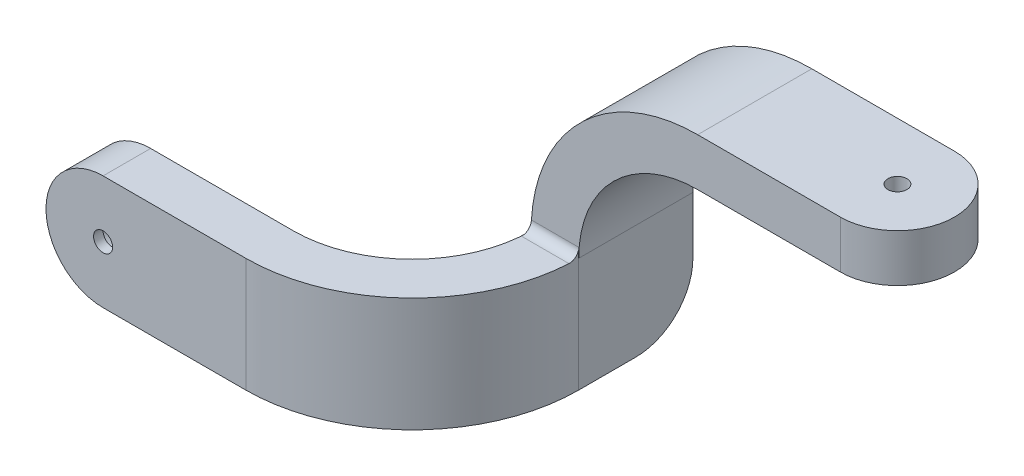
ISO-10303-21;
HEADER;
FILE_DESCRIPTION(('STEP AP214'),'2;1');
FILE_NAME('part.step','',(''),(''),'','','');
FILE_SCHEMA(('AUTOMOTIVE_DESIGN { 1 0 10303 214 1 1 1 1 }'));
ENDSEC;
DATA;
#1=APPLICATION_CONTEXT('core data for automotive mechanical design processes');
#2=APPLICATION_PROTOCOL_DEFINITION('international standard','automotive_design',2000,#1);
#3=PRODUCT_CONTEXT('',#1,'mechanical');
#4=PRODUCT('Part','Part','',(#3));
#5=PRODUCT_RELATED_PRODUCT_CATEGORY('part','',(#4));
#6=PRODUCT_DEFINITION_FORMATION('','',#4);
#7=PRODUCT_DEFINITION_CONTEXT('part definition',#1,'design');
#8=PRODUCT_DEFINITION('design','',#6,#7);
#9=PRODUCT_DEFINITION_SHAPE('','',#8);
#10=(LENGTH_UNIT() NAMED_UNIT(*) SI_UNIT(.MILLI.,.METRE.));
#11=(NAMED_UNIT(*) PLANE_ANGLE_UNIT() SI_UNIT($,.RADIAN.));
#12=(NAMED_UNIT(*) SI_UNIT($,.STERADIAN.) SOLID_ANGLE_UNIT());
#13=UNCERTAINTY_MEASURE_WITH_UNIT(LENGTH_MEASURE(1.E-05),#10,'distance_accuracy_value','');
#14=(GEOMETRIC_REPRESENTATION_CONTEXT(3) GLOBAL_UNCERTAINTY_ASSIGNED_CONTEXT((#13)) GLOBAL_UNIT_ASSIGNED_CONTEXT((#10,
#11,#12)) REPRESENTATION_CONTEXT('',''));
#15=CARTESIAN_POINT('',(0.,0.,0.));
#16=DIRECTION('',(0.,0.,1.));
#17=DIRECTION('',(1.,0.,0.));
#18=AXIS2_PLACEMENT_3D('',#15,#16,#17);
#19=CARTESIAN_POINT('',(-66.,-24.5,23.5));
#20=DIRECTION('',(0.,0.,-1.));
#21=DIRECTION('',(-1.,0.,0.));
#22=AXIS2_PLACEMENT_3D('',#19,#20,#21);
#23=PLANE('',#22);
#24=CARTESIAN_POINT('',(-60.,-18.5,23.5));
#25=DIRECTION('',(0.,0.,1.));
#26=DIRECTION('',(1.,0.,0.));
#27=AXIS2_PLACEMENT_3D('',#24,#25,#26);
#28=CIRCLE('',#27,0.999999999999998);
#29=CARTESIAN_POINT('',(-59.,-18.5,23.4999999999999));
#30=VERTEX_POINT('',#29);
#31=EDGE_CURVE('E220',#30,#30,#28,.T.);
#32=ORIENTED_EDGE('',*,*,#31,.F.);
#33=EDGE_LOOP('',(#32));
#34=FACE_BOUND('',#33,.T.);
#35=CARTESIAN_POINT('',(-60.,-18.5,23.5));
#36=DIRECTION('',(0.,0.,1.));
#37=DIRECTION('',(1.,0.,0.));
#38=AXIS2_PLACEMENT_3D('',#35,#36,#37);
#39=CIRCLE('',#38,6.);
#40=CARTESIAN_POINT('',(-60.,-12.5,23.5));
#41=VERTEX_POINT('',#40);
#42=CARTESIAN_POINT('',(-60.,-24.5,23.5));
#43=VERTEX_POINT('',#42);
#44=EDGE_CURVE('E201',#41,#43,#39,.T.);
#45=ORIENTED_EDGE('',*,*,#44,.T.);
#46=DIRECTION('',(1.,0.,0.));
#47=VECTOR('',#46,1.);
#48=CARTESIAN_POINT('',(-66.,-24.5,23.5));
#49=LINE('',#48,#47);
#50=CARTESIAN_POINT('',(-45.,-24.5,23.5));
#51=VERTEX_POINT('',#50);
#52=EDGE_CURVE('E205',#43,#51,#49,.T.);
#53=ORIENTED_EDGE('',*,*,#52,.T.);
#54=DIRECTION('',(0.,1.,0.));
#55=VECTOR('',#54,1.);
#56=CARTESIAN_POINT('',(-45.,-24.5,23.5));
#57=LINE('',#56,#55);
#58=CARTESIAN_POINT('',(-45.,-12.5,23.5));
#59=VERTEX_POINT('',#58);
#60=EDGE_CURVE('E228',#51,#59,#57,.T.);
#61=ORIENTED_EDGE('',*,*,#60,.T.);
#62=DIRECTION('',(1.,0.,0.));
#63=VECTOR('',#62,1.);
#64=CARTESIAN_POINT('',(-66.,-12.5,23.5));
#65=LINE('',#64,#63);
#66=EDGE_CURVE('E208',#41,#59,#65,.T.);
#67=ORIENTED_EDGE('',*,*,#66,.F.);
#68=EDGE_LOOP('',(#45,#53,#61,#67));
#69=FACE_BOUND('',#68,.T.);
#70=ADVANCED_FACE('F91',(#34,#69),#23,.F.);
#71=CARTESIAN_POINT('',(-66.,-12.5,18.5));
#72=DIRECTION('',(0.,0.,1.));
#73=DIRECTION('',(1.,0.,0.));
#74=AXIS2_PLACEMENT_3D('',#71,#72,#73);
#75=PLANE('',#74);
#76=CARTESIAN_POINT('',(-60.,-18.5,18.5));
#77=DIRECTION('',(0.,0.,1.));
#78=DIRECTION('',(1.,0.,0.));
#79=AXIS2_PLACEMENT_3D('',#76,#77,#78);
#80=CIRCLE('',#79,2.25);
#81=CARTESIAN_POINT('',(-57.75,-18.5,18.5));
#82=VERTEX_POINT('',#81);
#83=EDGE_CURVE('E458',#82,#82,#80,.F.);
#84=ORIENTED_EDGE('',*,*,#83,.F.);
#85=EDGE_LOOP('',(#84));
#86=FACE_BOUND('',#85,.T.);
#87=DIRECTION('',(1.,0.,0.));
#88=VECTOR('',#87,1.);
#89=CARTESIAN_POINT('',(-66.,-24.5,18.5));
#90=LINE('',#89,#88);
#91=CARTESIAN_POINT('',(-60.,-24.5,18.5));
#92=VERTEX_POINT('',#91);
#93=CARTESIAN_POINT('',(-45.,-24.5,18.5));
#94=VERTEX_POINT('',#93);
#95=EDGE_CURVE('E434',#92,#94,#90,.T.);
#96=ORIENTED_EDGE('',*,*,#95,.F.);
#97=CARTESIAN_POINT('',(-60.,-18.5,18.5));
#98=DIRECTION('',(0.,0.,1.));
#99=DIRECTION('',(1.,0.,0.));
#100=AXIS2_PLACEMENT_3D('',#97,#98,#99);
#101=CIRCLE('',#100,6.);
#102=CARTESIAN_POINT('',(-60.,-12.5,18.5));
#103=VERTEX_POINT('',#102);
#104=EDGE_CURVE('E212',#92,#103,#101,.F.);
#105=ORIENTED_EDGE('',*,*,#104,.T.);
#106=DIRECTION('',(1.,0.,0.));
#107=VECTOR('',#106,1.);
#108=CARTESIAN_POINT('',(-66.,-12.5,18.5));
#109=LINE('',#108,#107);
#110=CARTESIAN_POINT('',(-45.,-12.5,18.5));
#111=VERTEX_POINT('',#110);
#112=EDGE_CURVE('E230',#103,#111,#109,.T.);
#113=ORIENTED_EDGE('',*,*,#112,.T.);
#114=DIRECTION('',(0.,-1.,0.));
#115=VECTOR('',#114,1.);
#116=CARTESIAN_POINT('',(-45.,-12.5,18.5));
#117=LINE('',#116,#115);
#118=EDGE_CURVE('E240',#111,#94,#117,.T.);
#119=ORIENTED_EDGE('',*,*,#118,.T.);
#120=EDGE_LOOP('',(#96,#105,#113,#119));
#121=FACE_BOUND('',#120,.T.);
#122=ADVANCED_FACE('F387',(#86,#121),#75,.F.);
#123=CARTESIAN_POINT('',(-27.5,-12.5,6.));
#124=DIRECTION('',(0.,1.,0.));
#125=DIRECTION('',(0.,0.,1.));
#126=AXIS2_PLACEMENT_3D('',#123,#124,#125);
#127=PLANE('',#126);
#128=CARTESIAN_POINT('',(-45.,-12.5,6.));
#129=DIRECTION('',(0.,-1.,0.));
#130=DIRECTION('',(1.,0.,0.));
#131=AXIS2_PLACEMENT_3D('',#128,#129,#130);
#132=CIRCLE('',#131,17.5);
#133=CARTESIAN_POINT('',(-27.5285947903438,-12.5,7.));
#134=VERTEX_POINT('',#133);
#135=EDGE_CURVE('E235',#134,#59,#132,.T.);
#136=ORIENTED_EDGE('',*,*,#135,.F.);
#137=DIRECTION('',(-1.,0.,0.));
#138=VECTOR('',#137,1.);
#139=CARTESIAN_POINT('',(-32.5,-12.5,7.));
#140=LINE('',#139,#138);
#141=CARTESIAN_POINT('',(-32.5,-12.5,7.));
#142=VERTEX_POINT('',#141);
#143=EDGE_CURVE('E324',#134,#142,#140,.T.);
#144=ORIENTED_EDGE('',*,*,#143,.T.);
#145=DIRECTION('',(0.,0.,1.));
#146=VECTOR('',#145,1.);
#147=CARTESIAN_POINT('',(-32.5,-12.5,7.));
#148=LINE('',#147,#146);
#149=CARTESIAN_POINT('',(-32.5,-12.5,6.));
#150=VERTEX_POINT('',#149);
#151=EDGE_CURVE('E322',#142,#150,#148,.F.);
#152=ORIENTED_EDGE('',*,*,#151,.T.);
#153=CARTESIAN_POINT('',(-45.,-12.5,6.));
#154=DIRECTION('',(0.,-1.,0.));
#155=DIRECTION('',(1.,0.,0.));
#156=AXIS2_PLACEMENT_3D('',#153,#154,#155);
#157=CIRCLE('',#156,12.5);
#158=EDGE_CURVE('E236',#150,#111,#157,.T.);
#159=ORIENTED_EDGE('',*,*,#158,.T.);
#160=ORIENTED_EDGE('',*,*,#112,.F.);
#161=DIRECTION('',(0.,0.,1.));
#162=VECTOR('',#161,1.);
#163=CARTESIAN_POINT('',(-60.,-12.5,-6.001));
#164=LINE('',#163,#162);
#165=EDGE_CURVE('E211',#103,#41,#164,.T.);
#166=ORIENTED_EDGE('',*,*,#165,.T.);
#167=ORIENTED_EDGE('',*,*,#66,.T.);
#168=EDGE_LOOP('',(#136,#144,#152,#159,#160,#166,#167));
#169=FACE_BOUND('',#168,.T.);
#170=ADVANCED_FACE('F369',(#169),#127,.T.);
#171=CARTESIAN_POINT('',(0.,5.,0.));
#172=DIRECTION('',(0.,-1.,0.));
#173=DIRECTION('',(0.,0.,-1.));
#174=AXIS2_PLACEMENT_3D('',#171,#172,#173);
#175=CYLINDRICAL_SURFACE('',#174,6.);
#176=CARTESIAN_POINT('',(0.,0.,0.));
#177=DIRECTION('',(0.,1.,0.));
#178=DIRECTION('',(0.,0.,1.));
#179=AXIS2_PLACEMENT_3D('',#176,#177,#178);
#180=CIRCLE('',#179,6.);
#181=CARTESIAN_POINT('',(0.,0.,6.));
#182=VERTEX_POINT('',#181);
#183=CARTESIAN_POINT('',(0.,0.,-6.));
#184=VERTEX_POINT('',#183);
#185=EDGE_CURVE('E302',#182,#184,#180,.T.);
#186=ORIENTED_EDGE('',*,*,#185,.T.);
#187=DIRECTION('',(0.,-1.,0.));
#188=VECTOR('',#187,1.);
#189=CARTESIAN_POINT('',(0.,5.,-6.));
#190=LINE('',#189,#188);
#191=CARTESIAN_POINT('',(0.,5.,-6.));
#192=VERTEX_POINT('',#191);
#193=EDGE_CURVE('E300',#192,#184,#190,.T.);
#194=ORIENTED_EDGE('',*,*,#193,.F.);
#195=CARTESIAN_POINT('',(0.,5.,0.));
#196=DIRECTION('',(0.,1.,0.));
#197=DIRECTION('',(0.,0.,1.));
#198=AXIS2_PLACEMENT_3D('',#195,#196,#197);
#199=CIRCLE('',#198,6.);
#200=CARTESIAN_POINT('',(0.,5.,6.));
#201=VERTEX_POINT('',#200);
#202=EDGE_CURVE('E291',#201,#192,#199,.T.);
#203=ORIENTED_EDGE('',*,*,#202,.F.);
#204=DIRECTION('',(0.,-1.,0.));
#205=VECTOR('',#204,1.);
#206=CARTESIAN_POINT('',(0.,5.,6.));
#207=LINE('',#206,#205);
#208=EDGE_CURVE('E311',#201,#182,#207,.T.);
#209=ORIENTED_EDGE('',*,*,#208,.T.);
#210=EDGE_LOOP('',(#186,#194,#203,#209));
#211=FACE_BOUND('',#210,.T.);
#212=ADVANCED_FACE('F365',(#211),#175,.T.);
#213=CARTESIAN_POINT('',(0.,5.,-6.));
#214=DIRECTION('',(0.,0.,-1.));
#215=DIRECTION('',(-1.,0.,0.));
#216=AXIS2_PLACEMENT_3D('',#213,#214,#215);
#217=PLANE('',#216);
#218=DIRECTION('',(0.,1.,0.));
#219=VECTOR('',#218,1.);
#220=CARTESIAN_POINT('',(-27.5,-24.5,-6.));
#221=LINE('',#220,#219);
#222=CARTESIAN_POINT('',(-27.5,-18.5,-6.));
#223=VERTEX_POINT('',#222);
#224=CARTESIAN_POINT('',(-27.5,-12.5,-6.));
#225=VERTEX_POINT('',#224);
#226=EDGE_CURVE('E255',#223,#225,#221,.T.);
#227=ORIENTED_EDGE('',*,*,#226,.F.);
#228=DIRECTION('',(1.,0.,0.));
#229=VECTOR('',#228,1.);
#230=CARTESIAN_POINT('',(0.,-18.5,-6.));
#231=LINE('',#230,#229);
#232=CARTESIAN_POINT('',(-32.5,-18.5,-6.));
#233=VERTEX_POINT('',#232);
#234=EDGE_CURVE('E318',#223,#233,#231,.F.);
#235=ORIENTED_EDGE('',*,*,#234,.T.);
#236=DIRECTION('',(0.,1.,0.));
#237=VECTOR('',#236,1.);
#238=CARTESIAN_POINT('',(-32.5,-24.5,-6.));
#239=LINE('',#238,#237);
#240=CARTESIAN_POINT('',(-32.5,-12.5,-6.));
#241=VERTEX_POINT('',#240);
#242=EDGE_CURVE('E257',#233,#241,#239,.T.);
#243=ORIENTED_EDGE('',*,*,#242,.T.);
#244=CARTESIAN_POINT('',(-15.,-12.5,-6.));
#245=DIRECTION('',(0.,0.,1.));
#246=DIRECTION('',(0.,1.,0.));
#247=AXIS2_PLACEMENT_3D('',#244,#245,#246);
#248=CIRCLE('',#247,17.5);
#249=CARTESIAN_POINT('',(-15.,5.,-6.));
#250=VERTEX_POINT('',#249);
#251=EDGE_CURVE('E259',#250,#241,#248,.T.);
#252=ORIENTED_EDGE('',*,*,#251,.F.);
#253=DIRECTION('',(1.,0.,0.));
#254=VECTOR('',#253,1.);
#255=CARTESIAN_POINT('',(0.,5.,-6.));
#256=LINE('',#255,#254);
#257=EDGE_CURVE('E294',#250,#192,#256,.T.);
#258=ORIENTED_EDGE('',*,*,#257,.T.);
#259=ORIENTED_EDGE('',*,*,#193,.T.);
#260=DIRECTION('',(1.,0.,0.));
#261=VECTOR('',#260,1.);
#262=CARTESIAN_POINT('',(0.,0.,-6.));
#263=LINE('',#262,#261);
#264=CARTESIAN_POINT('',(-15.,0.,-6.));
#265=VERTEX_POINT('',#264);
#266=EDGE_CURVE('E305',#265,#184,#263,.T.);
#267=ORIENTED_EDGE('',*,*,#266,.F.);
#268=CARTESIAN_POINT('',(-15.,-12.5,-6.));
#269=DIRECTION('',(0.,0.,1.));
#270=DIRECTION('',(0.,1.,0.));
#271=AXIS2_PLACEMENT_3D('',#268,#269,#270);
#272=CIRCLE('',#271,12.5);
#273=EDGE_CURVE('E260',#265,#225,#272,.T.);
#274=ORIENTED_EDGE('',*,*,#273,.T.);
#275=EDGE_LOOP('',(#227,#235,#243,#252,#258,#259,#267,#274));
#276=FACE_BOUND('',#275,.T.);
#277=ADVANCED_FACE('F362',(#276),#217,.T.);
#278=CARTESIAN_POINT('',(0.,5.,6.));
#279=DIRECTION('',(0.,0.,1.));
#280=DIRECTION('',(1.,0.,0.));
#281=AXIS2_PLACEMENT_3D('',#278,#279,#280);
#282=PLANE('',#281);
#283=CARTESIAN_POINT('',(-15.,-12.5,6.));
#284=DIRECTION('',(0.,0.,1.));
#285=DIRECTION('',(0.,1.,0.));
#286=AXIS2_PLACEMENT_3D('',#283,#284,#285);
#287=CIRCLE('',#286,17.5);
#288=CARTESIAN_POINT('',(-15.,5.,6.));
#289=VERTEX_POINT('',#288);
#290=CARTESIAN_POINT('',(-32.4714052096561,-11.5,6.));
#291=VERTEX_POINT('',#290);
#292=EDGE_CURVE('E271',#289,#291,#287,.T.);
#293=ORIENTED_EDGE('',*,*,#292,.T.);
#294=DIRECTION('',(-1.,0.,0.));
#295=VECTOR('',#294,1.);
#296=CARTESIAN_POINT('',(-27.5,-11.5,6.));
#297=LINE('',#296,#295);
#298=CARTESIAN_POINT('',(-27.5,-11.5,6.));
#299=VERTEX_POINT('',#298);
#300=EDGE_CURVE('E328',#291,#299,#297,.F.);
#301=ORIENTED_EDGE('',*,*,#300,.T.);
#302=DIRECTION('',(0.,-1.,0.));
#303=VECTOR('',#302,1.);
#304=CARTESIAN_POINT('',(-27.5,-11.5,6.));
#305=LINE('',#304,#303);
#306=CARTESIAN_POINT('',(-27.5,-12.5,6.));
#307=VERTEX_POINT('',#306);
#308=EDGE_CURVE('E110',#299,#307,#305,.T.);
#309=ORIENTED_EDGE('',*,*,#308,.T.);
#310=CARTESIAN_POINT('',(-15.,-12.5,6.));
#311=DIRECTION('',(0.,0.,1.));
#312=DIRECTION('',(0.,1.,0.));
#313=AXIS2_PLACEMENT_3D('',#310,#311,#312);
#314=CIRCLE('',#313,12.5);
#315=CARTESIAN_POINT('',(-15.,0.,6.));
#316=VERTEX_POINT('',#315);
#317=EDGE_CURVE('E268',#316,#307,#314,.T.);
#318=ORIENTED_EDGE('',*,*,#317,.F.);
#319=DIRECTION('',(-1.,0.,0.));
#320=VECTOR('',#319,1.);
#321=CARTESIAN_POINT('',(0.,0.,6.));
#322=LINE('',#321,#320);
#323=EDGE_CURVE('E288',#182,#316,#322,.T.);
#324=ORIENTED_EDGE('',*,*,#323,.F.);
#325=ORIENTED_EDGE('',*,*,#208,.F.);
#326=DIRECTION('',(-1.,0.,0.));
#327=VECTOR('',#326,1.);
#328=CARTESIAN_POINT('',(0.,5.,6.));
#329=LINE('',#328,#327);
#330=EDGE_CURVE('E289',#201,#289,#329,.T.);
#331=ORIENTED_EDGE('',*,*,#330,.T.);
#332=EDGE_LOOP('',(#293,#301,#309,#318,#324,#325,#331));
#333=FACE_BOUND('',#332,.T.);
#334=ADVANCED_FACE('F360',(#333),#282,.T.);
#335=CARTESIAN_POINT('',(0.,0.,0.));
#336=DIRECTION('',(0.,1.,0.));
#337=DIRECTION('',(0.,0.,1.));
#338=AXIS2_PLACEMENT_3D('',#335,#336,#337);
#339=PLANE('',#338);
#340=CARTESIAN_POINT('',(0.,0.,0.));
#341=DIRECTION('',(0.,1.,0.));
#342=DIRECTION('',(0.,0.,1.));
#343=AXIS2_PLACEMENT_3D('',#340,#341,#342);
#344=CIRCLE('',#343,2.25);
#345=CARTESIAN_POINT('',(0.,0.,2.25));
#346=VERTEX_POINT('',#345);
#347=EDGE_CURVE('E276',#346,#346,#344,.T.);
#348=ORIENTED_EDGE('',*,*,#347,.T.);
#349=EDGE_LOOP('',(#348));
#350=FACE_BOUND('',#349,.T.);
#351=ORIENTED_EDGE('',*,*,#323,.T.);
#352=DIRECTION('',(0.,0.,-1.));
#353=VECTOR('',#352,1.);
#354=CARTESIAN_POINT('',(-15.,0.,0.));
#355=LINE('',#354,#353);
#356=EDGE_CURVE('E292',#316,#265,#355,.T.);
#357=ORIENTED_EDGE('',*,*,#356,.T.);
#358=ORIENTED_EDGE('',*,*,#266,.T.);
#359=ORIENTED_EDGE('',*,*,#185,.F.);
#360=EDGE_LOOP('',(#351,#357,#358,#359));
#361=FACE_BOUND('',#360,.T.);
#362=ADVANCED_FACE('F356',(#350,#361),#339,.F.);
#363=CARTESIAN_POINT('',(0.,5.,0.));
#364=DIRECTION('',(0.,1.,0.));
#365=DIRECTION('',(0.,0.,1.));
#366=AXIS2_PLACEMENT_3D('',#363,#364,#365);
#367=PLANE('',#366);
#368=CARTESIAN_POINT('',(0.,5.,0.));
#369=DIRECTION('',(0.,1.,0.));
#370=DIRECTION('',(0.,0.,1.));
#371=AXIS2_PLACEMENT_3D('',#368,#369,#370);
#372=CIRCLE('',#371,1.);
#373=CARTESIAN_POINT('',(0.,5.,1.));
#374=VERTEX_POINT('',#373);
#375=EDGE_CURVE('E283',#374,#374,#372,.T.);
#376=ORIENTED_EDGE('',*,*,#375,.F.);
#377=EDGE_LOOP('',(#376));
#378=FACE_BOUND('',#377,.T.);
#379=ORIENTED_EDGE('',*,*,#330,.F.);
#380=ORIENTED_EDGE('',*,*,#202,.T.);
#381=ORIENTED_EDGE('',*,*,#257,.F.);
#382=DIRECTION('',(0.,0.,-1.));
#383=VECTOR('',#382,1.);
#384=CARTESIAN_POINT('',(-15.,5.,0.));
#385=LINE('',#384,#383);
#386=EDGE_CURVE('E297',#289,#250,#385,.T.);
#387=ORIENTED_EDGE('',*,*,#386,.F.);
#388=EDGE_LOOP('',(#379,#380,#381,#387));
#389=FACE_BOUND('',#388,.T.);
#390=ADVANCED_FACE('F352',(#378,#389),#367,.T.);
#391=CARTESIAN_POINT('',(0.,5.001,0.));
#392=DIRECTION('',(0.,-1.,0.));
#393=DIRECTION('',(0.,0.,-1.));
#394=AXIS2_PLACEMENT_3D('',#391,#392,#393);
#395=CYLINDRICAL_SURFACE('',#394,1.);
#396=CARTESIAN_POINT('',(0.,3.5,0.));
#397=DIRECTION('',(0.,1.,0.));
#398=DIRECTION('',(0.,0.,1.));
#399=AXIS2_PLACEMENT_3D('',#396,#397,#398);
#400=CIRCLE('',#399,1.);
#401=CARTESIAN_POINT('',(0.,3.5,1.));
#402=VERTEX_POINT('',#401);
#403=EDGE_CURVE('E277',#402,#402,#400,.T.);
#404=ORIENTED_EDGE('',*,*,#403,.F.);
#405=EDGE_LOOP('',(#404));
#406=FACE_BOUND('',#405,.T.);
#407=ORIENTED_EDGE('',*,*,#375,.T.);
#408=EDGE_LOOP('',(#407));
#409=FACE_BOUND('',#408,.T.);
#410=ADVANCED_FACE('F348',(#406,#409),#395,.F.);
#411=CARTESIAN_POINT('',(0.,3.5,0.));
#412=DIRECTION('',(0.,-1.,0.));
#413=DIRECTION('',(0.,0.,-1.));
#414=AXIS2_PLACEMENT_3D('',#411,#412,#413);
#415=CYLINDRICAL_SURFACE('',#414,2.25);
#416=CARTESIAN_POINT('',(0.,3.5,0.));
#417=DIRECTION('',(0.,1.,0.));
#418=DIRECTION('',(0.,0.,1.));
#419=AXIS2_PLACEMENT_3D('',#416,#417,#418);
#420=CIRCLE('',#419,2.25);
#421=CARTESIAN_POINT('',(0.,3.5,2.25));
#422=VERTEX_POINT('',#421);
#423=EDGE_CURVE('E280',#422,#422,#420,.T.);
#424=ORIENTED_EDGE('',*,*,#423,.T.);
#425=EDGE_LOOP('',(#424));
#426=FACE_BOUND('',#425,.T.);
#427=ORIENTED_EDGE('',*,*,#347,.F.);
#428=EDGE_LOOP('',(#427));
#429=FACE_BOUND('',#428,.T.);
#430=ADVANCED_FACE('F344',(#426,#429),#415,.F.);
#431=CARTESIAN_POINT('',(0.,3.5,0.));
#432=DIRECTION('',(0.,1.,0.));
#433=DIRECTION('',(0.,0.,1.));
#434=AXIS2_PLACEMENT_3D('',#431,#432,#433);
#435=PLANE('',#434);
#436=ORIENTED_EDGE('',*,*,#403,.T.);
#437=EDGE_LOOP('',(#436));
#438=FACE_BOUND('',#437,.T.);
#439=ORIENTED_EDGE('',*,*,#423,.F.);
#440=EDGE_LOOP('',(#439));
#441=FACE_BOUND('',#440,.T.);
#442=ADVANCED_FACE('F340',(#438,#441),#435,.F.);
#443=CARTESIAN_POINT('',(-15.,-12.5,0.));
#444=DIRECTION('',(0.,0.,1.));
#445=DIRECTION('',(1.,0.,0.));
#446=AXIS2_PLACEMENT_3D('',#443,#444,#445);
#447=CYLINDRICAL_SURFACE('',#446,12.5);
#448=ORIENTED_EDGE('',*,*,#317,.T.);
#449=DIRECTION('',(0.,0.,1.));
#450=VECTOR('',#449,1.);
#451=CARTESIAN_POINT('',(-27.5,-12.5,-6.));
#452=LINE('',#451,#450);
#453=EDGE_CURVE('E263',#225,#307,#452,.T.);
#454=ORIENTED_EDGE('',*,*,#453,.F.);
#455=ORIENTED_EDGE('',*,*,#273,.F.);
#456=ORIENTED_EDGE('',*,*,#356,.F.);
#457=EDGE_LOOP('',(#448,#454,#455,#456));
#458=FACE_BOUND('',#457,.T.);
#459=ADVANCED_FACE('F339',(#458),#447,.F.);
#460=CARTESIAN_POINT('',(-15.,-12.5,0.));
#461=DIRECTION('',(0.,0.,1.));
#462=DIRECTION('',(1.,0.,0.));
#463=AXIS2_PLACEMENT_3D('',#460,#461,#462);
#464=CYLINDRICAL_SURFACE('',#463,17.5);
#465=DIRECTION('',(0.,0.,-1.));
#466=VECTOR('',#465,1.);
#467=CARTESIAN_POINT('',(-32.5,-12.5,6.));
#468=LINE('',#467,#466);
#469=EDGE_CURVE('E273',#150,#241,#468,.T.);
#470=ORIENTED_EDGE('',*,*,#469,.F.);
#471=ORIENTED_EDGE('',*,*,#151,.F.);
#472=CARTESIAN_POINT('',(-32.5,-12.5,7.));
#473=CARTESIAN_POINT('',(-32.4999996091509,-12.4999998127607,6.97186615677315));
#474=CARTESIAN_POINT('',(-32.5000000439234,-12.4988119854541,6.94374579158928));
#475=CARTESIAN_POINT('',(-32.4999992329581,-12.4940732576612,6.88770626954891));
#476=CARTESIAN_POINT('',(-32.4999979873007,-12.4905224702014,6.85978710313313));
#477=CARTESIAN_POINT('',(-32.4999867451649,-12.4763593403235,6.77667986746539));
#478=CARTESIAN_POINT('',(-32.4999692641114,-12.4622361372248,6.7220484542037));
#479=CARTESIAN_POINT('',(-32.4998491440497,-12.4250190547405,6.61593353593528));
#480=CARTESIAN_POINT('',(-32.4997464639824,-12.4019208529725,6.56445156155484));
#481=CARTESIAN_POINT('',(-32.4993558971677,-12.3474120868828,6.46609794134878));
#482=CARTESIAN_POINT('',(-32.4990680429394,-12.3160029826458,6.41922548769056));
#483=CARTESIAN_POINT('',(-32.4981883759898,-12.245769737472,6.33142829507339));
#484=CARTESIAN_POINT('',(-32.497596607766,-12.2069466825719,6.29050268653167));
#485=CARTESIAN_POINT('',(-32.4959885081659,-12.1229781478714,6.21574367072342));
#486=CARTESIAN_POINT('',(-32.4949720996022,-12.0778315196202,6.18191155452887));
#487=CARTESIAN_POINT('',(-32.4924126000598,-11.9825345730521,6.12232202613543));
#488=CARTESIAN_POINT('',(-32.4908697104046,-11.9323861725655,6.09656153460358));
#489=CARTESIAN_POINT('',(-32.4871893464979,-11.8285074442907,6.05383285658094));
#490=CARTESIAN_POINT('',(-32.4850522080629,-11.7747791525396,6.03685971971773));
#491=CARTESIAN_POINT('',(-32.4809997747978,-11.6839381158679,6.01636362900836));
#492=CARTESIAN_POINT('',(-32.4792559883734,-11.6473851673782,6.01022989057761));
#493=CARTESIAN_POINT('',(-32.4755168010448,-11.5738907943862,6.00204856292251));
#494=CARTESIAN_POINT('',(-32.4735217644906,-11.5369500020262,5.99999512758194));
#495=CARTESIAN_POINT('',(-32.4714052096561,-11.5,6.));
#496=B_SPLINE_CURVE_WITH_KNOTS('',3,(#472,#473,#474,#475,#476,#477,#478,#479,#480,#481,#482,
#483,#484,#485,#486,#487,#488,#489,#490,#491,#492,#493,#494,#495),.UNSPECIFIED.,.F.,.F.,(4,2,2,
2,2,2,2,2,2,2,2,4),(0.,0.0843496900531551,0.168695345736187,0.337109408409717,0.50560468045966,
0.674070370375946,0.842511401401841,1.01098306347175,1.17939037495667,1.34770271035486,
1.45880497908079,1.56974794923432),.UNSPECIFIED.);
#497=EDGE_CURVE('E104',#142,#291,#496,.T.);
#498=ORIENTED_EDGE('',*,*,#497,.T.);
#499=ORIENTED_EDGE('',*,*,#292,.F.);
#500=ORIENTED_EDGE('',*,*,#386,.T.);
#501=ORIENTED_EDGE('',*,*,#251,.T.);
#502=EDGE_LOOP('',(#470,#471,#498,#499,#500,#501));
#503=FACE_BOUND('',#502,.T.);
#504=ADVANCED_FACE('F333',(#503),#464,.T.);
#505=CARTESIAN_POINT('',(-32.5,-24.5,6.));
#506=DIRECTION('',(1.,0.,0.));
#507=DIRECTION('',(0.,0.,-1.));
#508=AXIS2_PLACEMENT_3D('',#505,#506,#507);
#509=PLANE('',#508);
#510=ORIENTED_EDGE('',*,*,#242,.F.);
#511=CARTESIAN_POINT('',(-32.5,-18.5,0.));
#512=DIRECTION('',(1.,0.,0.));
#513=DIRECTION('',(0.,0.,-1.));
#514=AXIS2_PLACEMENT_3D('',#511,#512,#513);
#515=CIRCLE('',#514,6.);
#516=CARTESIAN_POINT('',(-32.5,-24.5,0.));
#517=VERTEX_POINT('',#516);
#518=EDGE_CURVE('E320',#233,#517,#515,.F.);
#519=ORIENTED_EDGE('',*,*,#518,.T.);
#520=DIRECTION('',(0.,0.,-1.));
#521=VECTOR('',#520,1.);
#522=CARTESIAN_POINT('',(-32.5,-24.5,6.));
#523=LINE('',#522,#521);
#524=CARTESIAN_POINT('',(-32.5,-24.5,6.));
#525=VERTEX_POINT('',#524);
#526=EDGE_CURVE('E246',#525,#517,#523,.T.);
#527=ORIENTED_EDGE('',*,*,#526,.F.);
#528=DIRECTION('',(0.,1.,0.));
#529=VECTOR('',#528,1.);
#530=CARTESIAN_POINT('',(-32.5,-24.5,6.));
#531=LINE('',#530,#529);
#532=EDGE_CURVE('E250',#525,#150,#531,.T.);
#533=ORIENTED_EDGE('',*,*,#532,.T.);
#534=ORIENTED_EDGE('',*,*,#469,.T.);
#535=EDGE_LOOP('',(#510,#519,#527,#533,#534));
#536=FACE_BOUND('',#535,.T.);
#537=ADVANCED_FACE('F338',(#536),#509,.F.);
#538=CARTESIAN_POINT('',(-27.5,-24.5,-6.));
#539=DIRECTION('',(-1.,0.,0.));
#540=DIRECTION('',(0.,0.,1.));
#541=AXIS2_PLACEMENT_3D('',#538,#539,#540);
#542=PLANE('',#541);
#543=DIRECTION('',(0.,0.,1.));
#544=VECTOR('',#543,1.);
#545=CARTESIAN_POINT('',(-27.5,-24.5,-6.));
#546=LINE('',#545,#544);
#547=CARTESIAN_POINT('',(-27.5,-24.5,0.));
#548=VERTEX_POINT('',#547);
#549=CARTESIAN_POINT('',(-27.5,-24.5,6.));
#550=VERTEX_POINT('',#549);
#551=EDGE_CURVE('E248',#548,#550,#546,.T.);
#552=ORIENTED_EDGE('',*,*,#551,.F.);
#553=CARTESIAN_POINT('',(-27.5,-18.5,0.));
#554=DIRECTION('',(-1.,0.,0.));
#555=DIRECTION('',(0.,0.,1.));
#556=AXIS2_PLACEMENT_3D('',#553,#554,#555);
#557=CIRCLE('',#556,6.);
#558=EDGE_CURVE('E316',#548,#223,#557,.F.);
#559=ORIENTED_EDGE('',*,*,#558,.T.);
#560=ORIENTED_EDGE('',*,*,#226,.T.);
#561=ORIENTED_EDGE('',*,*,#453,.T.);
#562=DIRECTION('',(0.,1.,0.));
#563=VECTOR('',#562,1.);
#564=CARTESIAN_POINT('',(-27.5,-24.5,6.));
#565=LINE('',#564,#563);
#566=EDGE_CURVE('E253',#550,#307,#565,.T.);
#567=ORIENTED_EDGE('',*,*,#566,.F.);
#568=EDGE_LOOP('',(#552,#559,#560,#561,#567));
#569=FACE_BOUND('',#568,.T.);
#570=ADVANCED_FACE('F410',(#569),#542,.F.);
#571=CARTESIAN_POINT('',(0.,-24.5,0.));
#572=DIRECTION('',(0.,-1.,0.));
#573=DIRECTION('',(0.,0.,-1.));
#574=AXIS2_PLACEMENT_3D('',#571,#572,#573);
#575=PLANE('',#574);
#576=ORIENTED_EDGE('',*,*,#526,.T.);
#577=DIRECTION('',(1.,0.,0.));
#578=VECTOR('',#577,1.);
#579=CARTESIAN_POINT('',(0.,-24.5,0.));
#580=LINE('',#579,#578);
#581=EDGE_CURVE('E313',#517,#548,#580,.T.);
#582=ORIENTED_EDGE('',*,*,#581,.T.);
#583=ORIENTED_EDGE('',*,*,#551,.T.);
#584=CARTESIAN_POINT('',(-45.,-24.5,6.));
#585=DIRECTION('',(0.,-1.,0.));
#586=DIRECTION('',(1.,0.,0.));
#587=AXIS2_PLACEMENT_3D('',#584,#585,#586);
#588=CIRCLE('',#587,17.5);
#589=EDGE_CURVE('E225',#550,#51,#588,.T.);
#590=ORIENTED_EDGE('',*,*,#589,.T.);
#591=ORIENTED_EDGE('',*,*,#52,.F.);
#592=DIRECTION('',(0.,0.,1.));
#593=VECTOR('',#592,1.);
#594=CARTESIAN_POINT('',(-60.,-24.5,-6.001));
#595=LINE('',#594,#593);
#596=EDGE_CURVE('E215',#92,#43,#595,.T.);
#597=ORIENTED_EDGE('',*,*,#596,.F.);
#598=ORIENTED_EDGE('',*,*,#95,.T.);
#599=CARTESIAN_POINT('',(-45.,-24.5,6.));
#600=DIRECTION('',(0.,-1.,0.));
#601=DIRECTION('',(1.,0.,0.));
#602=AXIS2_PLACEMENT_3D('',#599,#600,#601);
#603=CIRCLE('',#602,12.5);
#604=EDGE_CURVE('E243',#525,#94,#603,.T.);
#605=ORIENTED_EDGE('',*,*,#604,.F.);
#606=EDGE_LOOP('',(#576,#582,#583,#590,#591,#597,#598,#605));
#607=FACE_BOUND('',#606,.T.);
#608=ADVANCED_FACE('F223',(#607),#575,.T.);
#609=CARTESIAN_POINT('',(-45.,-18.5,6.));
#610=DIRECTION('',(0.,-1.,0.));
#611=DIRECTION('',(0.,0.,-1.));
#612=AXIS2_PLACEMENT_3D('',#609,#610,#611);
#613=CYLINDRICAL_SURFACE('',#612,17.5);
#614=ORIENTED_EDGE('',*,*,#566,.T.);
#615=ORIENTED_EDGE('',*,*,#308,.F.);
#616=CARTESIAN_POINT('',(-27.5,-11.5,6.));
#617=CARTESIAN_POINT('',(-27.5000003908491,-11.5281338432268,6.0000001872393));
#618=CARTESIAN_POINT('',(-27.4999999560766,-11.5562542084107,6.0011880145459));
#619=CARTESIAN_POINT('',(-27.5000007670419,-11.6122937304511,6.00592674233877));
#620=CARTESIAN_POINT('',(-27.5000020126992,-11.6402128968669,6.00947752979864));
#621=CARTESIAN_POINT('',(-27.5000132548351,-11.7233201325346,6.02364065967649));
#622=CARTESIAN_POINT('',(-27.5000307358886,-11.7779515457963,6.03776386277518));
#623=CARTESIAN_POINT('',(-27.5001508559503,-11.8840664640647,6.07498094525952));
#624=CARTESIAN_POINT('',(-27.5002535360176,-11.9355484384452,6.09807914702753));
#625=CARTESIAN_POINT('',(-27.5006441028323,-12.0339020586512,6.15258791311725));
#626=CARTESIAN_POINT('',(-27.5009319570606,-12.0807745123094,6.18399701735416));
#627=CARTESIAN_POINT('',(-27.5018116240102,-12.1685717049266,6.254230262528));
#628=CARTESIAN_POINT('',(-27.502403392234,-12.2094973134683,6.29305331742809));
#629=CARTESIAN_POINT('',(-27.5040114918341,-12.2842563292766,6.37702185212862));
#630=CARTESIAN_POINT('',(-27.5050279003978,-12.3180884454711,6.42216848037977));
#631=CARTESIAN_POINT('',(-27.5075873999402,-12.3776779738646,6.51746542694791));
#632=CARTESIAN_POINT('',(-27.5091302895954,-12.4034384653964,6.56761382743449));
#633=CARTESIAN_POINT('',(-27.5128106535021,-12.4461671434191,6.67149255570933));
#634=CARTESIAN_POINT('',(-27.5149477919371,-12.4631402802823,6.72522084746037));
#635=CARTESIAN_POINT('',(-27.5190002252022,-12.4836363709916,6.81606188413207));
#636=CARTESIAN_POINT('',(-27.5207440116266,-12.4897701094224,6.85261483262175));
#637=CARTESIAN_POINT('',(-27.5244831989552,-12.4979514370775,6.92610920561382));
#638=CARTESIAN_POINT('',(-27.5264782355094,-12.5000048724181,6.96304999797378));
#639=CARTESIAN_POINT('',(-27.5285947903438,-12.5,7.));
#640=B_SPLINE_CURVE_WITH_KNOTS('',3,(#616,#617,#618,#619,#620,#621,#622,#623,#624,#625,#626,
#627,#628,#629,#630,#631,#632,#633,#634,#635,#636,#637,#638,#639),.UNSPECIFIED.,.F.,.F.,(4,2,2,
2,2,2,2,2,2,2,2,4),(0.,0.0843496900531559,0.168695345736187,0.337109408409718,0.50560468045966,
0.674070370375947,0.842511401401844,1.01098306347175,1.17939037495667,1.34770271035486,
1.45880497908079,1.56974794923432),.UNSPECIFIED.);
#641=EDGE_CURVE('E12',#299,#134,#640,.T.);
#642=ORIENTED_EDGE('',*,*,#641,.T.);
#643=ORIENTED_EDGE('',*,*,#135,.T.);
#644=ORIENTED_EDGE('',*,*,#60,.F.);
#645=ORIENTED_EDGE('',*,*,#589,.F.);
#646=EDGE_LOOP('',(#614,#615,#642,#643,#644,#645));
#647=FACE_BOUND('',#646,.T.);
#648=ADVANCED_FACE('F397',(#647),#613,.T.);
#649=CARTESIAN_POINT('',(-45.,-18.5,6.));
#650=DIRECTION('',(0.,-1.,0.));
#651=DIRECTION('',(0.,0.,-1.));
#652=AXIS2_PLACEMENT_3D('',#649,#650,#651);
#653=CYLINDRICAL_SURFACE('',#652,12.5);
#654=ORIENTED_EDGE('',*,*,#604,.T.);
#655=ORIENTED_EDGE('',*,*,#118,.F.);
#656=ORIENTED_EDGE('',*,*,#158,.F.);
#657=ORIENTED_EDGE('',*,*,#532,.F.);
#658=EDGE_LOOP('',(#654,#655,#656,#657));
#659=FACE_BOUND('',#658,.T.);
#660=ADVANCED_FACE('F401',(#659),#653,.F.);
#661=CARTESIAN_POINT('',(-60.,-18.5,-6.001));
#662=DIRECTION('',(0.,0.,1.));
#663=DIRECTION('',(1.,0.,0.));
#664=AXIS2_PLACEMENT_3D('',#661,#662,#663);
#665=CYLINDRICAL_SURFACE('',#664,6.);
#666=ORIENTED_EDGE('',*,*,#104,.F.);
#667=ORIENTED_EDGE('',*,*,#596,.T.);
#668=ORIENTED_EDGE('',*,*,#44,.F.);
#669=ORIENTED_EDGE('',*,*,#165,.F.);
#670=EDGE_LOOP('',(#666,#667,#668,#669));
#671=FACE_BOUND('',#670,.T.);
#672=ADVANCED_FACE('F216',(#671),#665,.T.);
#673=CARTESIAN_POINT('',(-60.,-18.5,-6.001));
#674=DIRECTION('',(0.,0.,1.));
#675=DIRECTION('',(1.,0.,0.));
#676=AXIS2_PLACEMENT_3D('',#673,#674,#675);
#677=CYLINDRICAL_SURFACE('',#676,0.999999999999998);
#678=CARTESIAN_POINT('',(-60.,-18.5,22.5));
#679=DIRECTION('',(0.,0.,1.));
#680=DIRECTION('',(1.,0.,0.));
#681=AXIS2_PLACEMENT_3D('',#678,#679,#680);
#682=CIRCLE('',#681,0.999999999999998);
#683=CARTESIAN_POINT('',(-59.,-18.5,22.4999999999999));
#684=VERTEX_POINT('',#683);
#685=EDGE_CURVE('E464',#684,#684,#682,.T.);
#686=CARTESIAN_POINT('',(-59.,-18.5,22.4999999999999));
#687=CARTESIAN_POINT('',(-59.,-18.5,22.5104166666666));
#688=CARTESIAN_POINT('',(-59.,-18.5,22.5208333333333));
#689=CARTESIAN_POINT('',(-59.,-18.5,22.5416666666666));
#690=CARTESIAN_POINT('',(-59.,-18.5,22.5520833333333));
#691=CARTESIAN_POINT('',(-59.,-18.5,22.5729166666666));
#692=CARTESIAN_POINT('',(-59.,-18.5,22.5833333333333));
#693=CARTESIAN_POINT('',(-59.,-18.5,22.6041666666666));
#694=CARTESIAN_POINT('',(-59.,-18.5,22.6145833333333));
#695=CARTESIAN_POINT('',(-59.,-18.5,22.6354166666666));
#696=CARTESIAN_POINT('',(-59.,-18.5,22.6458333333333));
#697=CARTESIAN_POINT('',(-59.,-18.5,22.6666666666666));
#698=CARTESIAN_POINT('',(-59.,-18.5,22.6770833333333));
#699=CARTESIAN_POINT('',(-59.,-18.5,22.6979166666666));
#700=CARTESIAN_POINT('',(-59.,-18.5,22.7083333333333));
#701=CARTESIAN_POINT('',(-59.,-18.5,22.7291666666666));
#702=CARTESIAN_POINT('',(-59.,-18.5,22.7395833333333));
#703=CARTESIAN_POINT('',(-59.,-18.5,22.7604166666666));
#704=CARTESIAN_POINT('',(-59.,-18.5,22.7708333333333));
#705=CARTESIAN_POINT('',(-59.,-18.5,22.7916666666666));
#706=CARTESIAN_POINT('',(-59.,-18.5,22.8020833333333));
#707=CARTESIAN_POINT('',(-59.,-18.5,22.8229166666666));
#708=CARTESIAN_POINT('',(-59.,-18.5,22.8333333333333));
#709=CARTESIAN_POINT('',(-59.,-18.5,22.8541666666666));
#710=CARTESIAN_POINT('',(-59.,-18.5,22.8645833333333));
#711=CARTESIAN_POINT('',(-59.,-18.5,22.8854166666666));
#712=CARTESIAN_POINT('',(-59.,-18.5,22.8958333333333));
#713=CARTESIAN_POINT('',(-59.,-18.5,22.9166666666666));
#714=CARTESIAN_POINT('',(-59.,-18.5,22.9270833333333));
#715=CARTESIAN_POINT('',(-59.,-18.5,22.9479166666666));
#716=CARTESIAN_POINT('',(-59.,-18.5,22.9583333333333));
#717=CARTESIAN_POINT('',(-59.,-18.5,22.9791666666666));
#718=CARTESIAN_POINT('',(-59.,-18.5,22.9895833333333));
#719=CARTESIAN_POINT('',(-59.,-18.5,23.0104166666666));
#720=CARTESIAN_POINT('',(-59.,-18.5,23.0208333333333));
#721=CARTESIAN_POINT('',(-59.,-18.5,23.0416666666666));
#722=CARTESIAN_POINT('',(-59.,-18.5,23.0520833333333));
#723=CARTESIAN_POINT('',(-59.,-18.5,23.0729166666666));
#724=CARTESIAN_POINT('',(-59.,-18.5,23.0833333333333));
#725=CARTESIAN_POINT('',(-59.,-18.5,23.1041666666666));
#726=CARTESIAN_POINT('',(-59.,-18.5,23.1145833333333));
#727=CARTESIAN_POINT('',(-59.,-18.5,23.1354166666666));
#728=CARTESIAN_POINT('',(-59.,-18.5,23.1458333333333));
#729=CARTESIAN_POINT('',(-59.,-18.5,23.1666666666666));
#730=CARTESIAN_POINT('',(-59.,-18.5,23.1770833333333));
#731=CARTESIAN_POINT('',(-59.,-18.5,23.1979166666666));
#732=CARTESIAN_POINT('',(-59.,-18.5,23.2083333333333));
#733=CARTESIAN_POINT('',(-59.,-18.5,23.2291666666666));
#734=CARTESIAN_POINT('',(-59.,-18.5,23.2395833333333));
#735=CARTESIAN_POINT('',(-59.,-18.5,23.2604166666666));
#736=CARTESIAN_POINT('',(-59.,-18.5,23.2708333333333));
#737=CARTESIAN_POINT('',(-59.,-18.5,23.2916666666666));
#738=CARTESIAN_POINT('',(-59.,-18.5,23.3020833333333));
#739=CARTESIAN_POINT('',(-59.,-18.5,23.3229166666666));
#740=CARTESIAN_POINT('',(-59.,-18.5,23.3333333333333));
#741=CARTESIAN_POINT('',(-59.,-18.5,23.3541666666666));
#742=CARTESIAN_POINT('',(-59.,-18.5,23.3645833333333));
#743=CARTESIAN_POINT('',(-59.,-18.5,23.3854166666666));
#744=CARTESIAN_POINT('',(-59.,-18.5,23.3958333333333));
#745=CARTESIAN_POINT('',(-59.,-18.5,23.4166666666666));
#746=CARTESIAN_POINT('',(-59.,-18.5,23.4270833333333));
#747=CARTESIAN_POINT('',(-59.,-18.5,23.4479166666666));
#748=CARTESIAN_POINT('',(-59.,-18.5,23.4583333333333));
#749=CARTESIAN_POINT('',(-59.,-18.5,23.4791666666666));
#750=CARTESIAN_POINT('',(-59.,-18.5,23.4895833333333));
#751=CARTESIAN_POINT('',(-59.,-18.5,23.4999999999999));
#752=B_SPLINE_CURVE_WITH_KNOTS('',3,(#686,#687,#688,#689,#690,#691,#692,#693,#694,#695,#696,
#697,#698,#699,#700,#701,#702,#703,#704,#705,#706,#707,#708,#709,#710,#711,#712,#713,#714,#715,
#716,#717,#718,#719,#720,#721,#722,#723,#724,#725,#726,#727,#728,#729,#730,#731,#732,#733,#734,
#735,#736,#737,#738,#739,#740,#741,#742,#743,#744,#745,#746,#747,#748,#749,#750,#751),
.UNSPECIFIED.,.F.,.F.,(4,2,2,2,2,2,2,2,2,2,2,2,2,2,2,2,2,2,2,2,2,2,2,2,2,2,2,2,2,2,2,2,4),(0.,
0.03125,0.0625000000000001,0.0937500000000001,0.125,0.15625,0.1875,0.21875,0.25,0.28125,0.3125,
0.34375,0.375,0.40625,0.4375,0.46875,0.5,0.53125,0.5625,0.593750000000001,0.625000000000001,
0.656250000000001,0.687500000000001,0.718750000000001,0.750000000000001,0.781250000000001,
0.812500000000001,0.843750000000001,0.875000000000001,0.906250000000001,0.937500000000001,
0.968750000000001,1.),.UNSPECIFIED.);
#753=EDGE_CURVE('BSEAM469',#684,#30,#752,.T.);
#754=ORIENTED_EDGE('',*,*,#685,.F.);
#755=ORIENTED_EDGE('',*,*,#31,.T.);
#756=ORIENTED_EDGE('',*,*,#753,.T.);
#757=ORIENTED_EDGE('',*,*,#753,.F.);
#758=EDGE_LOOP('',(#754,#756,#755,#757));
#759=FACE_BOUND('',#758,.T.);
#760=ADVANCED_FACE('F469',(#759),#677,.F.);
#761=CARTESIAN_POINT('',(-60.,-18.5,-6.001));
#762=DIRECTION('',(0.,0.,1.));
#763=DIRECTION('',(1.,0.,0.));
#764=AXIS2_PLACEMENT_3D('',#761,#762,#763);
#765=CYLINDRICAL_SURFACE('',#764,2.25);
#766=CARTESIAN_POINT('',(-60.,-18.5,22.5));
#767=DIRECTION('',(0.,0.,1.));
#768=DIRECTION('',(1.,0.,0.));
#769=AXIS2_PLACEMENT_3D('',#766,#767,#768);
#770=CIRCLE('',#769,2.25);
#771=CARTESIAN_POINT('',(-57.75,-18.5,22.4999999999999));
#772=VERTEX_POINT('',#771);
#773=EDGE_CURVE('E461',#772,#772,#770,.T.);
#774=CARTESIAN_POINT('',(-57.75,-18.5,22.4999999999999));
#775=CARTESIAN_POINT('',(-57.75,-18.5,22.4583333333333));
#776=CARTESIAN_POINT('',(-57.75,-18.5,22.4166666666666));
#777=CARTESIAN_POINT('',(-57.75,-18.5,22.3333333333333));
#778=CARTESIAN_POINT('',(-57.75,-18.5,22.2916666666666));
#779=CARTESIAN_POINT('',(-57.75,-18.5,22.2083333333333));
#780=CARTESIAN_POINT('',(-57.75,-18.5,22.1666666666666));
#781=CARTESIAN_POINT('',(-57.75,-18.5,22.0833333333333));
#782=CARTESIAN_POINT('',(-57.75,-18.5,22.0416666666666));
#783=CARTESIAN_POINT('',(-57.75,-18.5,21.9583333333333));
#784=CARTESIAN_POINT('',(-57.75,-18.5,21.9166666666666));
#785=CARTESIAN_POINT('',(-57.75,-18.5,21.8333333333333));
#786=CARTESIAN_POINT('',(-57.75,-18.5,21.7916666666666));
#787=CARTESIAN_POINT('',(-57.75,-18.5,21.7083333333333));
#788=CARTESIAN_POINT('',(-57.75,-18.5,21.6666666666666));
#789=CARTESIAN_POINT('',(-57.75,-18.5,21.5833333333333));
#790=CARTESIAN_POINT('',(-57.75,-18.5,21.5416666666666));
#791=CARTESIAN_POINT('',(-57.75,-18.5,21.4583333333333));
#792=CARTESIAN_POINT('',(-57.75,-18.5,21.4166666666666));
#793=CARTESIAN_POINT('',(-57.75,-18.5,21.3333333333333));
#794=CARTESIAN_POINT('',(-57.75,-18.5,21.2916666666666));
#795=CARTESIAN_POINT('',(-57.75,-18.5,21.2083333333333));
#796=CARTESIAN_POINT('',(-57.75,-18.5,21.1666666666666));
#797=CARTESIAN_POINT('',(-57.75,-18.5,21.0833333333333));
#798=CARTESIAN_POINT('',(-57.75,-18.5,21.0416666666666));
#799=CARTESIAN_POINT('',(-57.75,-18.5,20.9583333333333));
#800=CARTESIAN_POINT('',(-57.75,-18.5,20.9166666666666));
#801=CARTESIAN_POINT('',(-57.75,-18.5,20.8333333333333));
#802=CARTESIAN_POINT('',(-57.75,-18.5,20.7916666666666));
#803=CARTESIAN_POINT('',(-57.75,-18.5,20.7083333333333));
#804=CARTESIAN_POINT('',(-57.75,-18.5,20.6666666666666));
#805=CARTESIAN_POINT('',(-57.75,-18.5,20.5833333333333));
#806=CARTESIAN_POINT('',(-57.75,-18.5,20.5416666666666));
#807=CARTESIAN_POINT('',(-57.75,-18.5,20.4583333333333));
#808=CARTESIAN_POINT('',(-57.75,-18.5,20.4166666666667));
#809=CARTESIAN_POINT('',(-57.75,-18.5,20.3333333333333));
#810=CARTESIAN_POINT('',(-57.75,-18.5,20.2916666666667));
#811=CARTESIAN_POINT('',(-57.75,-18.5,20.2083333333333));
#812=CARTESIAN_POINT('',(-57.75,-18.5,20.1666666666667));
#813=CARTESIAN_POINT('',(-57.75,-18.5,20.0833333333333));
#814=CARTESIAN_POINT('',(-57.75,-18.5,20.0416666666667));
#815=CARTESIAN_POINT('',(-57.75,-18.5,19.9583333333333));
#816=CARTESIAN_POINT('',(-57.75,-18.5,19.9166666666667));
#817=CARTESIAN_POINT('',(-57.75,-18.5,19.8333333333333));
#818=CARTESIAN_POINT('',(-57.75,-18.5,19.7916666666667));
#819=CARTESIAN_POINT('',(-57.75,-18.5,19.7083333333333));
#820=CARTESIAN_POINT('',(-57.75,-18.5,19.6666666666667));
#821=CARTESIAN_POINT('',(-57.75,-18.5,19.5833333333333));
#822=CARTESIAN_POINT('',(-57.75,-18.5,19.5416666666667));
#823=CARTESIAN_POINT('',(-57.75,-18.5,19.4583333333333));
#824=CARTESIAN_POINT('',(-57.75,-18.5,19.4166666666667));
#825=CARTESIAN_POINT('',(-57.75,-18.5,19.3333333333333));
#826=CARTESIAN_POINT('',(-57.75,-18.5,19.2916666666667));
#827=CARTESIAN_POINT('',(-57.75,-18.5,19.2083333333333));
#828=CARTESIAN_POINT('',(-57.75,-18.5,19.1666666666667));
#829=CARTESIAN_POINT('',(-57.75,-18.5,19.0833333333333));
#830=CARTESIAN_POINT('',(-57.75,-18.5,19.0416666666667));
#831=CARTESIAN_POINT('',(-57.75,-18.5,18.9583333333333));
#832=CARTESIAN_POINT('',(-57.75,-18.5,18.9166666666667));
#833=CARTESIAN_POINT('',(-57.75,-18.5,18.8333333333333));
#834=CARTESIAN_POINT('',(-57.75,-18.5,18.7916666666667));
#835=CARTESIAN_POINT('',(-57.75,-18.5,18.7083333333333));
#836=CARTESIAN_POINT('',(-57.75,-18.5,18.6666666666667));
#837=CARTESIAN_POINT('',(-57.75,-18.5,18.5833333333333));
#838=CARTESIAN_POINT('',(-57.75,-18.5,18.5416666666667));
#839=CARTESIAN_POINT('',(-57.75,-18.5,18.5));
#840=B_SPLINE_CURVE_WITH_KNOTS('',3,(#774,#775,#776,#777,#778,#779,#780,#781,#782,#783,#784,
#785,#786,#787,#788,#789,#790,#791,#792,#793,#794,#795,#796,#797,#798,#799,#800,#801,#802,#803,
#804,#805,#806,#807,#808,#809,#810,#811,#812,#813,#814,#815,#816,#817,#818,#819,#820,#821,#822,
#823,#824,#825,#826,#827,#828,#829,#830,#831,#832,#833,#834,#835,#836,#837,#838,#839),
.UNSPECIFIED.,.F.,.F.,(4,2,2,2,2,2,2,2,2,2,2,2,2,2,2,2,2,2,2,2,2,2,2,2,2,2,2,2,2,2,2,2,4),(0.,
0.124999999999997,0.249999999999997,0.374999999999993,0.499999999999994,0.62499999999999,
0.749999999999987,0.874999999999987,0.999999999999984,1.12499999999998,1.24999999999998,
1.37499999999998,1.49999999999997,1.62499999999997,1.74999999999997,1.87499999999997,
1.99999999999997,2.12499999999996,2.24999999999996,2.37499999999996,2.49999999999996,
2.62499999999996,2.74999999999995,2.87499999999995,2.99999999999995,3.12499999999995,
3.24999999999995,3.37499999999994,3.49999999999994,3.62499999999994,3.74999999999994,
3.87499999999994,3.99999999999993),.UNSPECIFIED.);
#841=EDGE_CURVE('BSEAM382',#772,#82,#840,.T.);
#842=ORIENTED_EDGE('',*,*,#773,.T.);
#843=ORIENTED_EDGE('',*,*,#83,.T.);
#844=ORIENTED_EDGE('',*,*,#841,.T.);
#845=ORIENTED_EDGE('',*,*,#841,.F.);
#846=EDGE_LOOP('',(#842,#844,#843,#845));
#847=FACE_BOUND('',#846,.T.);
#848=ADVANCED_FACE('F382',(#847),#765,.F.);
#849=CARTESIAN_POINT('',(0.,0.,22.5));
#850=DIRECTION('',(0.,0.,1.));
#851=DIRECTION('',(1.,0.,0.));
#852=AXIS2_PLACEMENT_3D('',#849,#850,#851);
#853=PLANE('',#852);
#854=ORIENTED_EDGE('',*,*,#685,.T.);
#855=EDGE_LOOP('',(#854));
#856=FACE_BOUND('',#855,.T.);
#857=ORIENTED_EDGE('',*,*,#773,.F.);
#858=EDGE_LOOP('',(#857));
#859=FACE_BOUND('',#858,.T.);
#860=ADVANCED_FACE('F375',(#856,#859),#853,.F.);
#861=CARTESIAN_POINT('',(0.,-18.5,0.));
#862=DIRECTION('',(1.,0.,0.));
#863=DIRECTION('',(0.,0.,-1.));
#864=AXIS2_PLACEMENT_3D('',#861,#862,#863);
#865=CYLINDRICAL_SURFACE('',#864,6.);
#866=ORIENTED_EDGE('',*,*,#518,.F.);
#867=ORIENTED_EDGE('',*,*,#234,.F.);
#868=ORIENTED_EDGE('',*,*,#558,.F.);
#869=ORIENTED_EDGE('',*,*,#581,.F.);
#870=EDGE_LOOP('',(#866,#867,#868,#869));
#871=FACE_BOUND('',#870,.T.);
#872=ADVANCED_FACE('F373',(#871),#865,.T.);
#873=CARTESIAN_POINT('',(-27.5,-11.5,7.));
#874=DIRECTION('',(1.,0.,0.));
#875=DIRECTION('',(0.,0.,-1.));
#876=AXIS2_PLACEMENT_3D('',#873,#874,#875);
#877=CYLINDRICAL_SURFACE('',#876,1.);
#878=ORIENTED_EDGE('',*,*,#641,.F.);
#879=ORIENTED_EDGE('',*,*,#300,.F.);
#880=ORIENTED_EDGE('',*,*,#497,.F.);
#881=ORIENTED_EDGE('',*,*,#143,.F.);
#882=EDGE_LOOP('',(#878,#879,#880,#881));
#883=FACE_BOUND('',#882,.T.);
#884=ADVANCED_FACE('F93',(#883),#877,.F.);
#885=CLOSED_SHELL('',(#70,#122,#170,#212,#277,#334,#362,#390,#410,#430,#442,#459,#504,#537,#570,
#608,#648,#660,#672,#760,#848,#860,#872,#884));
#886=MANIFOLD_SOLID_BREP('B2',#885);
#887=ADVANCED_BREP_SHAPE_REPRESENTATION('',(#18,#886),#14);
#888=SHAPE_DEFINITION_REPRESENTATION(#9,#887);
ENDSEC;
END-ISO-10303-21;
